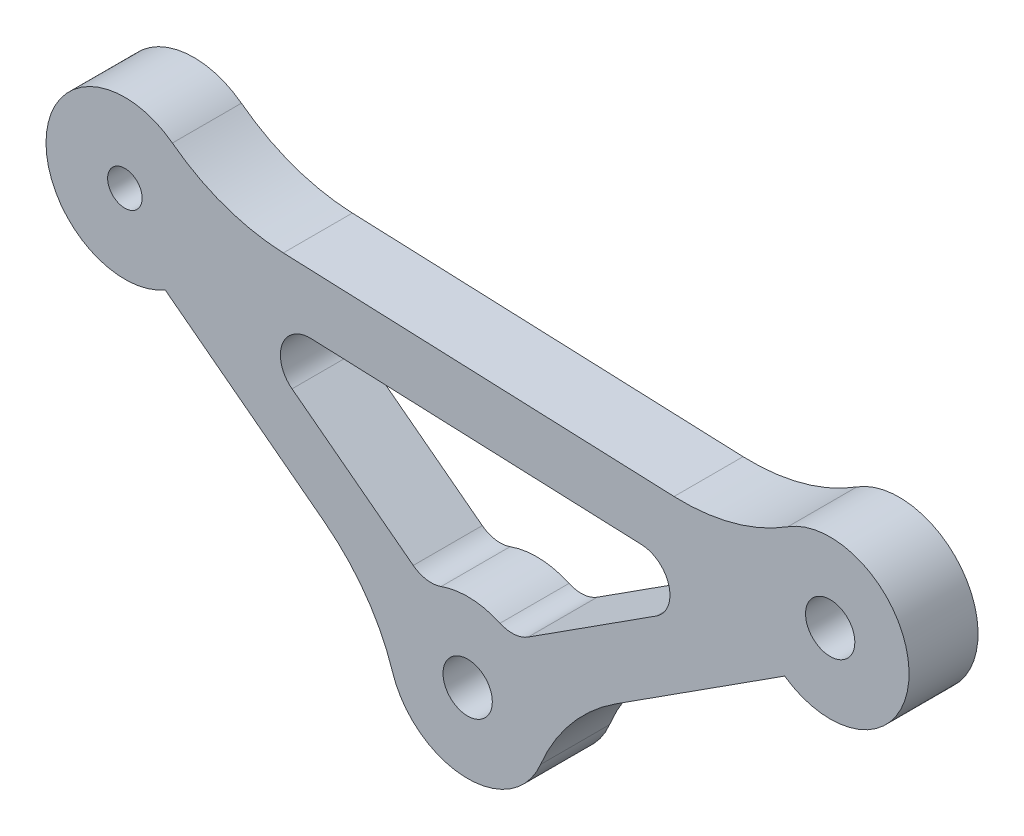
ISO-10303-21;
HEADER;
FILE_DESCRIPTION(('STEP AP214'),'2;1');
FILE_NAME('part.step','',(''),(''),'','','');
FILE_SCHEMA(('AUTOMOTIVE_DESIGN { 1 0 10303 214 1 1 1 1 }'));
ENDSEC;
DATA;
#1=APPLICATION_CONTEXT('core data for automotive mechanical design processes');
#2=APPLICATION_PROTOCOL_DEFINITION('international standard','automotive_design',2000,#1);
#3=PRODUCT_CONTEXT('',#1,'mechanical');
#4=PRODUCT('Part','Part','',(#3));
#5=PRODUCT_RELATED_PRODUCT_CATEGORY('part','',(#4));
#6=PRODUCT_DEFINITION_FORMATION('','',#4);
#7=PRODUCT_DEFINITION_CONTEXT('part definition',#1,'design');
#8=PRODUCT_DEFINITION('design','',#6,#7);
#9=PRODUCT_DEFINITION_SHAPE('','',#8);
#10=(LENGTH_UNIT() NAMED_UNIT(*) SI_UNIT(.MILLI.,.METRE.));
#11=(NAMED_UNIT(*) PLANE_ANGLE_UNIT() SI_UNIT($,.RADIAN.));
#12=(NAMED_UNIT(*) SI_UNIT($,.STERADIAN.) SOLID_ANGLE_UNIT());
#13=UNCERTAINTY_MEASURE_WITH_UNIT(LENGTH_MEASURE(1.E-05),#10,'distance_accuracy_value','');
#14=(GEOMETRIC_REPRESENTATION_CONTEXT(3) GLOBAL_UNCERTAINTY_ASSIGNED_CONTEXT((#13)) GLOBAL_UNIT_ASSIGNED_CONTEXT((#10,
#11,#12)) REPRESENTATION_CONTEXT('',''));
#15=CARTESIAN_POINT('',(0.,0.,0.));
#16=DIRECTION('',(0.,0.,1.));
#17=DIRECTION('',(1.,0.,0.));
#18=AXIS2_PLACEMENT_3D('',#15,#16,#17);
#19=CARTESIAN_POINT('',(-75.8246183935095,230.884392151583,7.));
#20=DIRECTION('',(0.,0.,-1.));
#21=DIRECTION('',(-1.,0.,0.));
#22=AXIS2_PLACEMENT_3D('',#19,#20,#21);
#23=CYLINDRICAL_SURFACE('',#22,8.00000000000001);
#24=CARTESIAN_POINT('',(-75.8246183935095,230.884392151583,7.));
#25=DIRECTION('',(0.,0.,1.));
#26=DIRECTION('',(1.,0.,0.));
#27=AXIS2_PLACEMENT_3D('',#24,#25,#26);
#28=CIRCLE('',#27,8.00000000000001);
#29=CARTESIAN_POINT('',(-71.0034898818186,237.268491138422,7.));
#30=VERTEX_POINT('',#29);
#31=CARTESIAN_POINT('',(-71.7416742694759,224.004743375663,7.));
#32=VERTEX_POINT('',#31);
#33=EDGE_CURVE('E229',#30,#32,#28,.T.);
#34=ORIENTED_EDGE('',*,*,#33,.F.);
#35=DIRECTION('',(0.,0.,-1.));
#36=VECTOR('',#35,1.);
#37=CARTESIAN_POINT('',(-71.0034898818186,237.268491138422,7.));
#38=LINE('',#37,#36);
#39=CARTESIAN_POINT('',(-71.0034898818186,237.268491138422,0.));
#40=VERTEX_POINT('',#39);
#41=EDGE_CURVE('E278',#30,#40,#38,.T.);
#42=ORIENTED_EDGE('',*,*,#41,.T.);
#43=CARTESIAN_POINT('',(-75.8246183935095,230.884392151583,0.));
#44=DIRECTION('',(0.,0.,1.));
#45=DIRECTION('',(1.,0.,0.));
#46=AXIS2_PLACEMENT_3D('',#43,#44,#45);
#47=CIRCLE('',#46,8.00000000000001);
#48=CARTESIAN_POINT('',(-71.7416742694759,224.004743375663,0.));
#49=VERTEX_POINT('',#48);
#50=EDGE_CURVE('E230',#40,#49,#47,.T.);
#51=ORIENTED_EDGE('',*,*,#50,.T.);
#52=DIRECTION('',(0.,0.,-1.));
#53=VECTOR('',#52,1.);
#54=CARTESIAN_POINT('',(-71.7416742694759,224.004743375663,7.));
#55=LINE('',#54,#53);
#56=EDGE_CURVE('E179',#32,#49,#55,.T.);
#57=ORIENTED_EDGE('',*,*,#56,.F.);
#58=EDGE_LOOP('',(#34,#42,#51,#57));
#59=FACE_BOUND('',#58,.T.);
#60=ADVANCED_FACE('F34',(#59),#23,.T.);
#61=CARTESIAN_POINT('',(-75.8246183935095,230.884392151583,7.));
#62=DIRECTION('',(0.,0.,-1.));
#63=DIRECTION('',(-1.,0.,0.));
#64=AXIS2_PLACEMENT_3D('',#61,#62,#63);
#65=CYLINDRICAL_SURFACE('',#64,1.75);
#66=CARTESIAN_POINT('',(-75.8246183935095,230.884392151583,7.));
#67=DIRECTION('',(0.,0.,1.));
#68=DIRECTION('',(1.,0.,0.));
#69=AXIS2_PLACEMENT_3D('',#66,#67,#68);
#70=CIRCLE('',#69,1.75);
#71=CARTESIAN_POINT('',(-74.0746183935095,230.884392151583,7.));
#72=VERTEX_POINT('',#71);
#73=EDGE_CURVE('E226',#72,#72,#70,.T.);
#74=ORIENTED_EDGE('',*,*,#73,.T.);
#75=EDGE_LOOP('',(#74));
#76=FACE_BOUND('',#75,.T.);
#77=CARTESIAN_POINT('',(-75.8246183935095,230.884392151583,0.));
#78=DIRECTION('',(0.,0.,1.));
#79=DIRECTION('',(1.,0.,0.));
#80=AXIS2_PLACEMENT_3D('',#77,#78,#79);
#81=CIRCLE('',#80,1.75);
#82=CARTESIAN_POINT('',(-74.0746183935095,230.884392151583,0.));
#83=VERTEX_POINT('',#82);
#84=EDGE_CURVE('E225',#83,#83,#81,.T.);
#85=ORIENTED_EDGE('',*,*,#84,.F.);
#86=EDGE_LOOP('',(#85));
#87=FACE_BOUND('',#86,.T.);
#88=ADVANCED_FACE('F344',(#76,#87),#65,.F.);
#89=CARTESIAN_POINT('',(0.,0.,7.));
#90=DIRECTION('',(0.,0.,1.));
#91=DIRECTION('',(1.,0.,0.));
#92=AXIS2_PLACEMENT_3D('',#89,#90,#91);
#93=PLANE('',#92);
#94=DIRECTION('',(0.795607349426792,-0.605812632369179,0.));
#95=VECTOR('',#94,1.);
#96=CARTESIAN_POINT('',(81.6379821522602,107.214302116319,7.));
#97=LINE('',#96,#95);
#98=CARTESIAN_POINT('',(-55.5738789971967,211.693828172878,7.));
#99=VERTEX_POINT('',#98);
#100=EDGE_CURVE('E198',#32,#99,#97,.T.);
#101=ORIENTED_EDGE('',*,*,#100,.T.);
#102=CARTESIAN_POINT('',(-67.6901316445803,195.781681184342,7.));
#103=DIRECTION('',(0.,0.,1.));
#104=DIRECTION('',(1.,0.,0.));
#105=AXIS2_PLACEMENT_3D('',#102,#103,#104);
#106=CIRCLE('',#105,20.);
#107=CARTESIAN_POINT('',(-48.6626165887926,201.942336247059,7.));
#108=VERTEX_POINT('',#107);
#109=EDGE_CURVE('E11',#99,#108,#106,.F.);
#110=ORIENTED_EDGE('',*,*,#109,.T.);
#111=CARTESIAN_POINT('',(-41.0516105664775,204.406598272145,7.));
#112=DIRECTION('',(0.,0.,1.));
#113=DIRECTION('',(1.,0.,0.));
#114=AXIS2_PLACEMENT_3D('',#111,#112,#113);
#115=CIRCLE('',#114,8.);
#116=CARTESIAN_POINT('',(-33.6613972737846,201.343144748995,7.));
#117=VERTEX_POINT('',#116);
#118=EDGE_CURVE('E304',#108,#117,#115,.T.);
#119=ORIENTED_EDGE('',*,*,#118,.T.);
#120=CARTESIAN_POINT('',(-15.1858640420522,193.684510941118,7.));
#121=DIRECTION('',(0.,0.,1.));
#122=DIRECTION('',(1.,0.,0.));
#123=AXIS2_PLACEMENT_3D('',#120,#121,#122);
#124=CIRCLE('',#123,20.);
#125=CARTESIAN_POINT('',(-25.9943886810119,210.51233893908,7.));
#126=VERTEX_POINT('',#125);
#127=EDGE_CURVE('E297',#117,#126,#124,.F.);
#128=ORIENTED_EDGE('',*,*,#127,.T.);
#129=DIRECTION('',(0.84139139989811,0.540426231947987,0.));
#130=VECTOR('',#129,1.);
#131=CARTESIAN_POINT('',(-103.313996709106,160.849905465932,7.));
#132=LINE('',#131,#130);
#133=CARTESIAN_POINT('',(-8.89620085354924,221.494515868691,7.));
#134=VERTEX_POINT('',#133);
#135=EDGE_CURVE('E180',#126,#134,#132,.T.);
#136=ORIENTED_EDGE('',*,*,#135,.T.);
#137=CARTESIAN_POINT('',(-4.27755392241352,228.026598272145,7.));
#138=DIRECTION('',(0.,0.,1.));
#139=DIRECTION('',(1.,0.,0.));
#140=AXIS2_PLACEMENT_3D('',#137,#138,#139);
#141=CIRCLE('',#140,8.);
#142=CARTESIAN_POINT('',(-8.57413749411873,234.774884692515,7.));
#143=VERTEX_POINT('',#142);
#144=EDGE_CURVE('E178',#134,#143,#141,.T.);
#145=ORIENTED_EDGE('',*,*,#144,.T.);
#146=CARTESIAN_POINT('',(-19.3155964233818,251.645600743441,7.));
#147=DIRECTION('',(0.,0.,1.));
#148=DIRECTION('',(1.,0.,0.));
#149=AXIS2_PLACEMENT_3D('',#146,#147,#148);
#150=CIRCLE('',#149,20.);
#151=CARTESIAN_POINT('',(-20.1138169842295,231.66153599334,7.));
#152=VERTEX_POINT('',#151);
#153=EDGE_CURVE('E282',#143,#152,#150,.F.);
#154=ORIENTED_EDGE('',*,*,#153,.T.);
#155=DIRECTION('',(-0.999203237505063,0.0399110280423881,0.));
#156=VECTOR('',#155,1.);
#157=CARTESIAN_POINT('',(9.20644421166959,230.490401110189,7.));
#158=LINE('',#157,#156);
#159=CARTESIAN_POINT('',(-59.7488891634392,233.244673855419,7.));
#160=VERTEX_POINT('',#159);
#161=EDGE_CURVE('E169',#152,#160,#158,.T.);
#162=ORIENTED_EDGE('',*,*,#161,.T.);
#163=CARTESIAN_POINT('',(-58.9506686025914,253.22873860552,7.));
#164=DIRECTION('',(0.,0.,1.));
#165=DIRECTION('',(1.,0.,0.));
#166=AXIS2_PLACEMENT_3D('',#163,#164,#165);
#167=CIRCLE('',#166,20.);
#168=EDGE_CURVE('E286',#160,#30,#167,.F.);
#169=ORIENTED_EDGE('',*,*,#168,.T.);
#170=ORIENTED_EDGE('',*,*,#33,.T.);
#171=EDGE_LOOP('',(#101,#110,#119,#128,#136,#145,#154,#162,#169,#170));
#172=FACE_BOUND('',#171,.T.);
#173=ORIENTED_EDGE('',*,*,#73,.F.);
#174=EDGE_LOOP('',(#173));
#175=FACE_BOUND('',#174,.T.);
#176=DIRECTION('',(0.84139139989811,0.540426231947986,0.));
#177=VECTOR('',#176,1.);
#178=CARTESIAN_POINT('',(-106.556554100794,165.898253865321,7.));
#179=LINE('',#178,#177);
#180=CARTESIAN_POINT('',(-34.9156438449769,211.913256143171,7.));
#181=VERTEX_POINT('',#180);
#182=CARTESIAN_POINT('',(-21.9101481622772,220.266694301998,7.));
#183=VERTEX_POINT('',#182);
#184=EDGE_CURVE('E206',#181,#183,#179,.T.);
#185=ORIENTED_EDGE('',*,*,#184,.F.);
#186=CARTESIAN_POINT('',(-36.5369225408209,214.437430342866,7.));
#187=DIRECTION('',(0.,0.,1.));
#188=DIRECTION('',(1.,0.,0.));
#189=AXIS2_PLACEMENT_3D('',#186,#187,#188);
#190=CIRCLE('',#189,3.);
#191=CARTESIAN_POINT('',(-37.7682010932727,211.701748869033,7.));
#192=VERTEX_POINT('',#191);
#193=EDGE_CURVE('E261',#181,#192,#190,.F.);
#194=ORIENTED_EDGE('',*,*,#193,.T.);
#195=CARTESIAN_POINT('',(-43.7427098642042,211.940387794675,7.));
#196=VERTEX_POINT('',#195);
#197=EDGE_CURVE('E192',#192,#196,#115,.T.);
#198=ORIENTED_EDGE('',*,*,#197,.T.);
#199=CARTESIAN_POINT('',(-44.7518721008517,214.765558865623,7.));
#200=DIRECTION('',(0.,0.,1.));
#201=DIRECTION('',(1.,0.,0.));
#202=AXIS2_PLACEMENT_3D('',#199,#200,#201);
#203=CIRCLE('',#202,3.);
#204=CARTESIAN_POINT('',(-46.5693099979593,212.378736817343,7.));
#205=VERTEX_POINT('',#204);
#206=EDGE_CURVE('E257',#196,#205,#203,.F.);
#207=ORIENTED_EDGE('',*,*,#206,.T.);
#208=DIRECTION('',(0.795607349426791,-0.605812632369181,0.));
#209=VECTOR('',#208,1.);
#210=CARTESIAN_POINT('',(85.2728579464753,111.987946212879,7.));
#211=LINE('',#210,#209);
#212=CARTESIAN_POINT('',(-58.8671156914182,221.742861023695,7.));
#213=VERTEX_POINT('',#212);
#214=EDGE_CURVE('E200',#213,#205,#211,.T.);
#215=ORIENTED_EDGE('',*,*,#214,.F.);
#216=CARTESIAN_POINT('',(-57.0496777943106,224.129683071975,7.));
#217=DIRECTION('',(0.,0.,1.));
#218=DIRECTION('',(1.,0.,0.));
#219=AXIS2_PLACEMENT_3D('',#216,#217,#218);
#220=CIRCLE('',#219,3.);
#221=CARTESIAN_POINT('',(-56.9299447101834,227.127292784491,7.));
#222=VERTEX_POINT('',#221);
#223=EDGE_CURVE('E269',#213,#222,#220,.F.);
#224=ORIENTED_EDGE('',*,*,#223,.T.);
#225=DIRECTION('',(-0.999203237505063,0.0399110280423876,0.));
#226=VECTOR('',#225,1.);
#227=CARTESIAN_POINT('',(8.96697804341517,224.495181685158,7.));
#228=LINE('',#227,#226);
#229=CARTESIAN_POINT('',(-23.411693773994,225.788478214207,7.));
#230=VERTEX_POINT('',#229);
#231=EDGE_CURVE('E203',#230,#222,#228,.T.);
#232=ORIENTED_EDGE('',*,*,#231,.F.);
#233=CARTESIAN_POINT('',(-23.5314268581212,222.790868501692,7.));
#234=DIRECTION('',(0.,0.,1.));
#235=DIRECTION('',(1.,0.,0.));
#236=AXIS2_PLACEMENT_3D('',#233,#234,#235);
#237=CIRCLE('',#236,3.);
#238=EDGE_CURVE('E265',#230,#183,#237,.F.);
#239=ORIENTED_EDGE('',*,*,#238,.T.);
#240=EDGE_LOOP('',(#185,#194,#198,#207,#215,#224,#232,#239));
#241=FACE_BOUND('',#240,.T.);
#242=CARTESIAN_POINT('',(-4.27755392241352,228.026598272145,7.));
#243=DIRECTION('',(0.,0.,1.));
#244=DIRECTION('',(1.,0.,0.));
#245=AXIS2_PLACEMENT_3D('',#242,#243,#244);
#246=CIRCLE('',#245,2.5);
#247=CARTESIAN_POINT('',(-1.77755392241352,228.026598272145,7.));
#248=VERTEX_POINT('',#247);
#249=EDGE_CURVE('E186',#248,#248,#246,.T.);
#250=ORIENTED_EDGE('',*,*,#249,.F.);
#251=EDGE_LOOP('',(#250));
#252=FACE_BOUND('',#251,.T.);
#253=CARTESIAN_POINT('',(-41.0516105664775,204.406598272145,7.));
#254=DIRECTION('',(0.,0.,1.));
#255=DIRECTION('',(1.,0.,0.));
#256=AXIS2_PLACEMENT_3D('',#253,#254,#255);
#257=CIRCLE('',#256,2.5);
#258=CARTESIAN_POINT('',(-38.5516105664775,204.406598272145,7.));
#259=VERTEX_POINT('',#258);
#260=EDGE_CURVE('E317',#259,#259,#257,.T.);
#261=ORIENTED_EDGE('',*,*,#260,.F.);
#262=EDGE_LOOP('',(#261));
#263=FACE_BOUND('',#262,.T.);
#264=ADVANCED_FACE('F301',(#172,#175,#241,#252,#263),#93,.T.);
#265=CARTESIAN_POINT('',(0.,0.,0.));
#266=DIRECTION('',(0.,0.,1.));
#267=DIRECTION('',(1.,0.,0.));
#268=AXIS2_PLACEMENT_3D('',#265,#266,#267);
#269=PLANE('',#268);
#270=CARTESIAN_POINT('',(-41.0516105664775,204.406598272145,0.));
#271=DIRECTION('',(0.,0.,1.));
#272=DIRECTION('',(1.,0.,0.));
#273=AXIS2_PLACEMENT_3D('',#270,#271,#272);
#274=CIRCLE('',#273,8.);
#275=CARTESIAN_POINT('',(-48.6626165887926,201.942336247059,0.));
#276=VERTEX_POINT('',#275);
#277=CARTESIAN_POINT('',(-33.6613972737846,201.343144748995,0.));
#278=VERTEX_POINT('',#277);
#279=EDGE_CURVE('E309',#276,#278,#274,.T.);
#280=ORIENTED_EDGE('',*,*,#279,.F.);
#281=CARTESIAN_POINT('',(-67.6901316445803,195.781681184342,0.));
#282=DIRECTION('',(0.,0.,1.));
#283=DIRECTION('',(1.,0.,0.));
#284=AXIS2_PLACEMENT_3D('',#281,#282,#283);
#285=CIRCLE('',#284,20.);
#286=CARTESIAN_POINT('',(-55.5738789971967,211.693828172878,0.));
#287=VERTEX_POINT('',#286);
#288=EDGE_CURVE('E42',#276,#287,#285,.T.);
#289=ORIENTED_EDGE('',*,*,#288,.T.);
#290=DIRECTION('',(0.795607349426792,-0.605812632369179,0.));
#291=VECTOR('',#290,1.);
#292=CARTESIAN_POINT('',(81.6379821522602,107.214302116319,0.));
#293=LINE('',#292,#291);
#294=EDGE_CURVE('E213',#49,#287,#293,.T.);
#295=ORIENTED_EDGE('',*,*,#294,.F.);
#296=ORIENTED_EDGE('',*,*,#50,.F.);
#297=CARTESIAN_POINT('',(-58.9506686025914,253.22873860552,0.));
#298=DIRECTION('',(0.,0.,1.));
#299=DIRECTION('',(1.,0.,0.));
#300=AXIS2_PLACEMENT_3D('',#297,#298,#299);
#301=CIRCLE('',#300,20.);
#302=CARTESIAN_POINT('',(-59.7488891634392,233.244673855419,0.));
#303=VERTEX_POINT('',#302);
#304=EDGE_CURVE('E284',#40,#303,#301,.T.);
#305=ORIENTED_EDGE('',*,*,#304,.T.);
#306=DIRECTION('',(-0.999203237505063,0.0399110280423881,0.));
#307=VECTOR('',#306,1.);
#308=CARTESIAN_POINT('',(9.20644421166959,230.490401110189,0.));
#309=LINE('',#308,#307);
#310=CARTESIAN_POINT('',(-20.1138169842295,231.66153599334,0.));
#311=VERTEX_POINT('',#310);
#312=EDGE_CURVE('E210',#311,#303,#309,.T.);
#313=ORIENTED_EDGE('',*,*,#312,.F.);
#314=CARTESIAN_POINT('',(-19.3155964233818,251.645600743441,0.));
#315=DIRECTION('',(0.,0.,1.));
#316=DIRECTION('',(1.,0.,0.));
#317=AXIS2_PLACEMENT_3D('',#314,#315,#316);
#318=CIRCLE('',#317,20.);
#319=CARTESIAN_POINT('',(-8.57413749411873,234.774884692515,0.));
#320=VERTEX_POINT('',#319);
#321=EDGE_CURVE('E185',#311,#320,#318,.T.);
#322=ORIENTED_EDGE('',*,*,#321,.T.);
#323=CARTESIAN_POINT('',(-4.27755392241352,228.026598272145,0.));
#324=DIRECTION('',(0.,0.,1.));
#325=DIRECTION('',(1.,0.,0.));
#326=AXIS2_PLACEMENT_3D('',#323,#324,#325);
#327=CIRCLE('',#326,8.);
#328=CARTESIAN_POINT('',(-8.89620085354927,221.494515868691,0.));
#329=VERTEX_POINT('',#328);
#330=EDGE_CURVE('E175',#329,#320,#327,.T.);
#331=ORIENTED_EDGE('',*,*,#330,.F.);
#332=DIRECTION('',(0.84139139989811,0.540426231947987,0.));
#333=VECTOR('',#332,1.);
#334=CARTESIAN_POINT('',(-103.313996709106,160.849905465932,0.));
#335=LINE('',#334,#333);
#336=CARTESIAN_POINT('',(-25.9943886810119,210.51233893908,0.));
#337=VERTEX_POINT('',#336);
#338=EDGE_CURVE('E160',#337,#329,#335,.T.);
#339=ORIENTED_EDGE('',*,*,#338,.F.);
#340=CARTESIAN_POINT('',(-15.1858640420522,193.684510941118,0.));
#341=DIRECTION('',(0.,0.,1.));
#342=DIRECTION('',(1.,0.,0.));
#343=AXIS2_PLACEMENT_3D('',#340,#341,#342);
#344=CIRCLE('',#343,20.);
#345=EDGE_CURVE('E295',#337,#278,#344,.T.);
#346=ORIENTED_EDGE('',*,*,#345,.T.);
#347=EDGE_LOOP('',(#280,#289,#295,#296,#305,#313,#322,#331,#339,#346));
#348=FACE_BOUND('',#347,.T.);
#349=ORIENTED_EDGE('',*,*,#84,.T.);
#350=EDGE_LOOP('',(#349));
#351=FACE_BOUND('',#350,.T.);
#352=DIRECTION('',(-0.999203237505063,0.0399110280423876,0.));
#353=VECTOR('',#352,1.);
#354=CARTESIAN_POINT('',(8.96697804341517,224.495181685158,0.));
#355=LINE('',#354,#353);
#356=CARTESIAN_POINT('',(-23.411693773994,225.788478214207,0.));
#357=VERTEX_POINT('',#356);
#358=CARTESIAN_POINT('',(-56.9299447101834,227.127292784491,0.));
#359=VERTEX_POINT('',#358);
#360=EDGE_CURVE('E218',#357,#359,#355,.T.);
#361=ORIENTED_EDGE('',*,*,#360,.T.);
#362=CARTESIAN_POINT('',(-57.0496777943106,224.129683071975,0.));
#363=DIRECTION('',(0.,0.,1.));
#364=DIRECTION('',(1.,0.,0.));
#365=AXIS2_PLACEMENT_3D('',#362,#363,#364);
#366=CIRCLE('',#365,3.);
#367=CARTESIAN_POINT('',(-58.8671156914182,221.742861023695,0.));
#368=VERTEX_POINT('',#367);
#369=EDGE_CURVE('E267',#359,#368,#366,.T.);
#370=ORIENTED_EDGE('',*,*,#369,.T.);
#371=DIRECTION('',(0.795607349426791,-0.605812632369181,0.));
#372=VECTOR('',#371,1.);
#373=CARTESIAN_POINT('',(85.2728579464753,111.987946212879,0.));
#374=LINE('',#373,#372);
#375=CARTESIAN_POINT('',(-46.5693099979593,212.378736817343,0.));
#376=VERTEX_POINT('',#375);
#377=EDGE_CURVE('E215',#368,#376,#374,.T.);
#378=ORIENTED_EDGE('',*,*,#377,.T.);
#379=CARTESIAN_POINT('',(-44.7518721008517,214.765558865623,0.));
#380=DIRECTION('',(0.,0.,1.));
#381=DIRECTION('',(1.,0.,0.));
#382=AXIS2_PLACEMENT_3D('',#379,#380,#381);
#383=CIRCLE('',#382,3.);
#384=CARTESIAN_POINT('',(-43.7427098642042,211.940387794675,0.));
#385=VERTEX_POINT('',#384);
#386=EDGE_CURVE('E255',#376,#385,#383,.T.);
#387=ORIENTED_EDGE('',*,*,#386,.T.);
#388=CARTESIAN_POINT('',(-37.7682010932727,211.701748869033,0.));
#389=VERTEX_POINT('',#388);
#390=EDGE_CURVE('E313',#389,#385,#274,.T.);
#391=ORIENTED_EDGE('',*,*,#390,.F.);
#392=CARTESIAN_POINT('',(-36.5369225408209,214.437430342866,0.));
#393=DIRECTION('',(0.,0.,1.));
#394=DIRECTION('',(1.,0.,0.));
#395=AXIS2_PLACEMENT_3D('',#392,#393,#394);
#396=CIRCLE('',#395,3.);
#397=CARTESIAN_POINT('',(-34.9156438449769,211.913256143171,0.));
#398=VERTEX_POINT('',#397);
#399=EDGE_CURVE('E259',#389,#398,#396,.T.);
#400=ORIENTED_EDGE('',*,*,#399,.T.);
#401=DIRECTION('',(0.84139139989811,0.540426231947986,0.));
#402=VECTOR('',#401,1.);
#403=CARTESIAN_POINT('',(-106.556554100794,165.898253865321,0.));
#404=LINE('',#403,#402);
#405=CARTESIAN_POINT('',(-21.9101481622772,220.266694301998,0.));
#406=VERTEX_POINT('',#405);
#407=EDGE_CURVE('E170',#398,#406,#404,.T.);
#408=ORIENTED_EDGE('',*,*,#407,.T.);
#409=CARTESIAN_POINT('',(-23.5314268581212,222.790868501692,0.));
#410=DIRECTION('',(0.,0.,1.));
#411=DIRECTION('',(1.,0.,0.));
#412=AXIS2_PLACEMENT_3D('',#409,#410,#411);
#413=CIRCLE('',#412,3.);
#414=EDGE_CURVE('E263',#406,#357,#413,.T.);
#415=ORIENTED_EDGE('',*,*,#414,.T.);
#416=EDGE_LOOP('',(#361,#370,#378,#387,#391,#400,#408,#415));
#417=FACE_BOUND('',#416,.T.);
#418=CARTESIAN_POINT('',(-4.27755392241352,228.026598272145,0.));
#419=DIRECTION('',(0.,0.,1.));
#420=DIRECTION('',(1.,0.,0.));
#421=AXIS2_PLACEMENT_3D('',#418,#419,#420);
#422=CIRCLE('',#421,2.5);
#423=CARTESIAN_POINT('',(-1.77755392241352,228.026598272145,0.));
#424=VERTEX_POINT('',#423);
#425=EDGE_CURVE('E187',#424,#424,#422,.T.);
#426=ORIENTED_EDGE('',*,*,#425,.T.);
#427=EDGE_LOOP('',(#426));
#428=FACE_BOUND('',#427,.T.);
#429=CARTESIAN_POINT('',(-41.0516105664775,204.406598272145,0.));
#430=DIRECTION('',(0.,0.,1.));
#431=DIRECTION('',(1.,0.,0.));
#432=AXIS2_PLACEMENT_3D('',#429,#430,#431);
#433=CIRCLE('',#432,2.5);
#434=CARTESIAN_POINT('',(-38.5516105664775,204.406598272145,0.));
#435=VERTEX_POINT('',#434);
#436=EDGE_CURVE('E314',#435,#435,#433,.T.);
#437=ORIENTED_EDGE('',*,*,#436,.T.);
#438=EDGE_LOOP('',(#437));
#439=FACE_BOUND('',#438,.T.);
#440=ADVANCED_FACE('F182',(#348,#351,#417,#428,#439),#269,.F.);
#441=CARTESIAN_POINT('',(9.20644421166959,230.490401110189,7.));
#442=DIRECTION('',(-0.0399110280423881,-0.999203237505063,0.));
#443=DIRECTION('',(0.999203237505063,-0.0399110280423881,0.));
#444=AXIS2_PLACEMENT_3D('',#441,#442,#443);
#445=PLANE('',#444);
#446=ORIENTED_EDGE('',*,*,#161,.F.);
#447=DIRECTION('',(0.,0.,1.));
#448=VECTOR('',#447,1.);
#449=CARTESIAN_POINT('',(-20.1138169842295,231.66153599334,0.));
#450=LINE('',#449,#448);
#451=EDGE_CURVE('E273',#152,#311,#450,.F.);
#452=ORIENTED_EDGE('',*,*,#451,.T.);
#453=ORIENTED_EDGE('',*,*,#312,.T.);
#454=DIRECTION('',(0.,0.,1.));
#455=VECTOR('',#454,1.);
#456=CARTESIAN_POINT('',(-59.7488891634392,233.244673855419,7.));
#457=LINE('',#456,#455);
#458=EDGE_CURVE('E271',#303,#160,#457,.T.);
#459=ORIENTED_EDGE('',*,*,#458,.T.);
#460=EDGE_LOOP('',(#446,#452,#453,#459));
#461=FACE_BOUND('',#460,.T.);
#462=ADVANCED_FACE('F327',(#461),#445,.F.);
#463=CARTESIAN_POINT('',(81.6379821522602,107.214302116319,7.));
#464=DIRECTION('',(0.605812632369179,0.795607349426792,0.));
#465=DIRECTION('',(-0.795607349426792,0.605812632369179,0.));
#466=AXIS2_PLACEMENT_3D('',#463,#464,#465);
#467=PLANE('',#466);
#468=ORIENTED_EDGE('',*,*,#294,.T.);
#469=DIRECTION('',(0.,0.,1.));
#470=VECTOR('',#469,1.);
#471=CARTESIAN_POINT('',(-55.5738789971967,211.693828172878,7.));
#472=LINE('',#471,#470);
#473=EDGE_CURVE('E49',#287,#99,#472,.T.);
#474=ORIENTED_EDGE('',*,*,#473,.T.);
#475=ORIENTED_EDGE('',*,*,#100,.F.);
#476=ORIENTED_EDGE('',*,*,#56,.T.);
#477=EDGE_LOOP('',(#468,#474,#475,#476));
#478=FACE_BOUND('',#477,.T.);
#479=ADVANCED_FACE('F419',(#478),#467,.F.);
#480=CARTESIAN_POINT('',(85.2728579464753,111.987946212879,7.));
#481=DIRECTION('',(0.605812632369181,0.795607349426791,0.));
#482=DIRECTION('',(-0.795607349426791,0.605812632369181,0.));
#483=AXIS2_PLACEMENT_3D('',#480,#481,#482);
#484=PLANE('',#483);
#485=ORIENTED_EDGE('',*,*,#214,.T.);
#486=DIRECTION('',(0.,0.,-1.));
#487=VECTOR('',#486,1.);
#488=CARTESIAN_POINT('',(-46.5693099979593,212.378736817343,7.));
#489=LINE('',#488,#487);
#490=EDGE_CURVE('E237',#205,#376,#489,.T.);
#491=ORIENTED_EDGE('',*,*,#490,.T.);
#492=ORIENTED_EDGE('',*,*,#377,.F.);
#493=DIRECTION('',(0.,0.,-1.));
#494=VECTOR('',#493,1.);
#495=CARTESIAN_POINT('',(-58.8671156914181,221.742861023695,7.));
#496=LINE('',#495,#494);
#497=EDGE_CURVE('E232',#368,#213,#496,.F.);
#498=ORIENTED_EDGE('',*,*,#497,.T.);
#499=EDGE_LOOP('',(#485,#491,#492,#498));
#500=FACE_BOUND('',#499,.T.);
#501=ADVANCED_FACE('F424',(#500),#484,.T.);
#502=CARTESIAN_POINT('',(8.96697804341517,224.495181685158,7.));
#503=DIRECTION('',(-0.0399110280423876,-0.999203237505063,0.));
#504=DIRECTION('',(0.999203237505063,-0.0399110280423876,0.));
#505=AXIS2_PLACEMENT_3D('',#502,#503,#504);
#506=PLANE('',#505);
#507=ORIENTED_EDGE('',*,*,#360,.F.);
#508=DIRECTION('',(0.,0.,-1.));
#509=VECTOR('',#508,1.);
#510=CARTESIAN_POINT('',(-23.411693773994,225.788478214207,7.));
#511=LINE('',#510,#509);
#512=EDGE_CURVE('E253',#357,#230,#511,.F.);
#513=ORIENTED_EDGE('',*,*,#512,.T.);
#514=ORIENTED_EDGE('',*,*,#231,.T.);
#515=DIRECTION('',(0.,0.,-1.));
#516=VECTOR('',#515,1.);
#517=CARTESIAN_POINT('',(-56.9299447101834,227.127292784491,0.));
#518=LINE('',#517,#516);
#519=EDGE_CURVE('E250',#222,#359,#518,.T.);
#520=ORIENTED_EDGE('',*,*,#519,.T.);
#521=EDGE_LOOP('',(#507,#513,#514,#520));
#522=FACE_BOUND('',#521,.T.);
#523=ADVANCED_FACE('F477',(#522),#506,.T.);
#524=CARTESIAN_POINT('',(-106.556554100794,165.898253865321,7.));
#525=DIRECTION('',(-0.540426231947986,0.84139139989811,0.));
#526=DIRECTION('',(-0.84139139989811,-0.540426231947986,0.));
#527=AXIS2_PLACEMENT_3D('',#524,#525,#526);
#528=PLANE('',#527);
#529=ORIENTED_EDGE('',*,*,#407,.F.);
#530=DIRECTION('',(0.,0.,-1.));
#531=VECTOR('',#530,1.);
#532=CARTESIAN_POINT('',(-34.9156438449769,211.913256143171,7.));
#533=LINE('',#532,#531);
#534=EDGE_CURVE('E248',#398,#181,#533,.F.);
#535=ORIENTED_EDGE('',*,*,#534,.T.);
#536=ORIENTED_EDGE('',*,*,#184,.T.);
#537=DIRECTION('',(0.,0.,-1.));
#538=VECTOR('',#537,1.);
#539=CARTESIAN_POINT('',(-21.9101481622772,220.266694301998,0.));
#540=LINE('',#539,#538);
#541=EDGE_CURVE('E245',#183,#406,#540,.T.);
#542=ORIENTED_EDGE('',*,*,#541,.T.);
#543=EDGE_LOOP('',(#529,#535,#536,#542));
#544=FACE_BOUND('',#543,.T.);
#545=ADVANCED_FACE('F410',(#544),#528,.T.);
#546=CARTESIAN_POINT('',(-103.313996709106,160.849905465932,7.));
#547=DIRECTION('',(-0.540426231947986,0.84139139989811,0.));
#548=DIRECTION('',(-0.84139139989811,-0.540426231947987,0.));
#549=AXIS2_PLACEMENT_3D('',#546,#547,#548);
#550=PLANE('',#549);
#551=ORIENTED_EDGE('',*,*,#135,.F.);
#552=DIRECTION('',(0.,0.,1.));
#553=VECTOR('',#552,1.);
#554=CARTESIAN_POINT('',(-25.994388681012,210.51233893908,0.));
#555=LINE('',#554,#553);
#556=EDGE_CURVE('E167',#126,#337,#555,.F.);
#557=ORIENTED_EDGE('',*,*,#556,.T.);
#558=ORIENTED_EDGE('',*,*,#338,.T.);
#559=DIRECTION('',(0.,0.,-1.));
#560=VECTOR('',#559,1.);
#561=CARTESIAN_POINT('',(-8.89620085354924,221.494515868691,7.));
#562=LINE('',#561,#560);
#563=EDGE_CURVE('E164',#134,#329,#562,.T.);
#564=ORIENTED_EDGE('',*,*,#563,.F.);
#565=EDGE_LOOP('',(#551,#557,#558,#564));
#566=FACE_BOUND('',#565,.T.);
#567=ADVANCED_FACE('F163',(#566),#550,.F.);
#568=CARTESIAN_POINT('',(-4.27755392241352,228.026598272145,7.));
#569=DIRECTION('',(0.,0.,-1.));
#570=DIRECTION('',(-1.,0.,0.));
#571=AXIS2_PLACEMENT_3D('',#568,#569,#570);
#572=CYLINDRICAL_SURFACE('',#571,8.);
#573=ORIENTED_EDGE('',*,*,#330,.T.);
#574=DIRECTION('',(0.,0.,-1.));
#575=VECTOR('',#574,1.);
#576=CARTESIAN_POINT('',(-8.57413749411874,234.774884692515,7.));
#577=LINE('',#576,#575);
#578=EDGE_CURVE('E276',#320,#143,#577,.F.);
#579=ORIENTED_EDGE('',*,*,#578,.T.);
#580=ORIENTED_EDGE('',*,*,#144,.F.);
#581=ORIENTED_EDGE('',*,*,#563,.T.);
#582=EDGE_LOOP('',(#573,#579,#580,#581));
#583=FACE_BOUND('',#582,.T.);
#584=ADVANCED_FACE('F174',(#583),#572,.T.);
#585=CARTESIAN_POINT('',(-4.27755392241352,228.026598272145,7.));
#586=DIRECTION('',(0.,0.,-1.));
#587=DIRECTION('',(-1.,0.,0.));
#588=AXIS2_PLACEMENT_3D('',#585,#586,#587);
#589=CYLINDRICAL_SURFACE('',#588,2.5);
#590=ORIENTED_EDGE('',*,*,#249,.T.);
#591=EDGE_LOOP('',(#590));
#592=FACE_BOUND('',#591,.T.);
#593=ORIENTED_EDGE('',*,*,#425,.F.);
#594=EDGE_LOOP('',(#593));
#595=FACE_BOUND('',#594,.T.);
#596=ADVANCED_FACE('F397',(#592,#595),#589,.F.);
#597=CARTESIAN_POINT('',(-41.0516105664775,204.406598272145,7.));
#598=DIRECTION('',(0.,0.,-1.));
#599=DIRECTION('',(-1.,0.,0.));
#600=AXIS2_PLACEMENT_3D('',#597,#598,#599);
#601=CYLINDRICAL_SURFACE('',#600,8.);
#602=ORIENTED_EDGE('',*,*,#279,.T.);
#603=DIRECTION('',(0.,0.,-1.));
#604=VECTOR('',#603,1.);
#605=CARTESIAN_POINT('',(-33.6613972737846,201.343144748995,7.));
#606=LINE('',#605,#604);
#607=EDGE_CURVE('E292',#278,#117,#606,.F.);
#608=ORIENTED_EDGE('',*,*,#607,.T.);
#609=ORIENTED_EDGE('',*,*,#118,.F.);
#610=DIRECTION('',(0.,0.,-1.));
#611=VECTOR('',#610,1.);
#612=CARTESIAN_POINT('',(-48.6626165887926,201.942336247059,7.));
#613=LINE('',#612,#611);
#614=EDGE_CURVE('E289',#108,#276,#613,.T.);
#615=ORIENTED_EDGE('',*,*,#614,.T.);
#616=EDGE_LOOP('',(#602,#608,#609,#615));
#617=FACE_BOUND('',#616,.T.);
#618=ADVANCED_FACE('F311',(#617),#601,.T.);
#619=CARTESIAN_POINT('',(-41.0516105664775,204.406598272145,7.));
#620=DIRECTION('',(0.,0.,-1.));
#621=DIRECTION('',(-1.,0.,0.));
#622=AXIS2_PLACEMENT_3D('',#619,#620,#621);
#623=CYLINDRICAL_SURFACE('',#622,2.5);
#624=ORIENTED_EDGE('',*,*,#260,.T.);
#625=EDGE_LOOP('',(#624));
#626=FACE_BOUND('',#625,.T.);
#627=ORIENTED_EDGE('',*,*,#436,.F.);
#628=EDGE_LOOP('',(#627));
#629=FACE_BOUND('',#628,.T.);
#630=ADVANCED_FACE('F396',(#626,#629),#623,.F.);
#631=ORIENTED_EDGE('',*,*,#390,.T.);
#632=DIRECTION('',(0.,0.,-1.));
#633=VECTOR('',#632,1.);
#634=CARTESIAN_POINT('',(-43.7427098642042,211.940387794675,7.));
#635=LINE('',#634,#633);
#636=EDGE_CURVE('E243',#385,#196,#635,.F.);
#637=ORIENTED_EDGE('',*,*,#636,.T.);
#638=ORIENTED_EDGE('',*,*,#197,.F.);
#639=DIRECTION('',(0.,0.,-1.));
#640=VECTOR('',#639,1.);
#641=CARTESIAN_POINT('',(-37.7682010932727,211.701748869033,7.));
#642=LINE('',#641,#640);
#643=EDGE_CURVE('E240',#192,#389,#642,.T.);
#644=ORIENTED_EDGE('',*,*,#643,.T.);
#645=EDGE_LOOP('',(#631,#637,#638,#644));
#646=FACE_BOUND('',#645,.T.);
#647=ADVANCED_FACE('F358',(#646),#601,.T.);
#648=CARTESIAN_POINT('',(-44.7518721008517,214.765558865623,7.));
#649=DIRECTION('',(0.,0.,-1.));
#650=DIRECTION('',(-1.,0.,0.));
#651=AXIS2_PLACEMENT_3D('',#648,#649,#650);
#652=CYLINDRICAL_SURFACE('',#651,3.);
#653=ORIENTED_EDGE('',*,*,#206,.F.);
#654=ORIENTED_EDGE('',*,*,#636,.F.);
#655=ORIENTED_EDGE('',*,*,#386,.F.);
#656=ORIENTED_EDGE('',*,*,#490,.F.);
#657=EDGE_LOOP('',(#653,#654,#655,#656));
#658=FACE_BOUND('',#657,.T.);
#659=ADVANCED_FACE('F354',(#658),#652,.F.);
#660=CARTESIAN_POINT('',(-36.5369225408209,214.437430342866,7.));
#661=DIRECTION('',(0.,0.,-1.));
#662=DIRECTION('',(-1.,0.,0.));
#663=AXIS2_PLACEMENT_3D('',#660,#661,#662);
#664=CYLINDRICAL_SURFACE('',#663,3.);
#665=ORIENTED_EDGE('',*,*,#193,.F.);
#666=ORIENTED_EDGE('',*,*,#534,.F.);
#667=ORIENTED_EDGE('',*,*,#399,.F.);
#668=ORIENTED_EDGE('',*,*,#643,.F.);
#669=EDGE_LOOP('',(#665,#666,#667,#668));
#670=FACE_BOUND('',#669,.T.);
#671=ADVANCED_FACE('F357',(#670),#664,.F.);
#672=CARTESIAN_POINT('',(-23.5314268581212,222.790868501692,7.));
#673=DIRECTION('',(0.,0.,1.));
#674=DIRECTION('',(1.,0.,0.));
#675=AXIS2_PLACEMENT_3D('',#672,#673,#674);
#676=CYLINDRICAL_SURFACE('',#675,3.);
#677=ORIENTED_EDGE('',*,*,#238,.F.);
#678=ORIENTED_EDGE('',*,*,#512,.F.);
#679=ORIENTED_EDGE('',*,*,#414,.F.);
#680=ORIENTED_EDGE('',*,*,#541,.F.);
#681=EDGE_LOOP('',(#677,#678,#679,#680));
#682=FACE_BOUND('',#681,.T.);
#683=ADVANCED_FACE('F362',(#682),#676,.F.);
#684=CARTESIAN_POINT('',(-57.0496777943106,224.129683071975,7.));
#685=DIRECTION('',(0.,0.,1.));
#686=DIRECTION('',(1.,0.,0.));
#687=AXIS2_PLACEMENT_3D('',#684,#685,#686);
#688=CYLINDRICAL_SURFACE('',#687,3.);
#689=ORIENTED_EDGE('',*,*,#223,.F.);
#690=ORIENTED_EDGE('',*,*,#497,.F.);
#691=ORIENTED_EDGE('',*,*,#369,.F.);
#692=ORIENTED_EDGE('',*,*,#519,.F.);
#693=EDGE_LOOP('',(#689,#690,#691,#692));
#694=FACE_BOUND('',#693,.T.);
#695=ADVANCED_FACE('F366',(#694),#688,.F.);
#696=CARTESIAN_POINT('',(-19.3155964233818,251.645600743441,7.));
#697=DIRECTION('',(0.,0.,-1.));
#698=DIRECTION('',(-1.,0.,0.));
#699=AXIS2_PLACEMENT_3D('',#696,#697,#698);
#700=CYLINDRICAL_SURFACE('',#699,20.);
#701=ORIENTED_EDGE('',*,*,#153,.F.);
#702=ORIENTED_EDGE('',*,*,#578,.F.);
#703=ORIENTED_EDGE('',*,*,#321,.F.);
#704=ORIENTED_EDGE('',*,*,#451,.F.);
#705=EDGE_LOOP('',(#701,#702,#703,#704));
#706=FACE_BOUND('',#705,.T.);
#707=ADVANCED_FACE('F325',(#706),#700,.F.);
#708=CARTESIAN_POINT('',(-58.9506686025914,253.22873860552,7.));
#709=DIRECTION('',(0.,0.,-1.));
#710=DIRECTION('',(-1.,0.,0.));
#711=AXIS2_PLACEMENT_3D('',#708,#709,#710);
#712=CYLINDRICAL_SURFACE('',#711,20.);
#713=ORIENTED_EDGE('',*,*,#168,.F.);
#714=ORIENTED_EDGE('',*,*,#458,.F.);
#715=ORIENTED_EDGE('',*,*,#304,.F.);
#716=ORIENTED_EDGE('',*,*,#41,.F.);
#717=EDGE_LOOP('',(#713,#714,#715,#716));
#718=FACE_BOUND('',#717,.T.);
#719=ADVANCED_FACE('F333',(#718),#712,.F.);
#720=CARTESIAN_POINT('',(-15.1858640420522,193.684510941118,7.));
#721=DIRECTION('',(0.,0.,-1.));
#722=DIRECTION('',(-1.,0.,0.));
#723=AXIS2_PLACEMENT_3D('',#720,#721,#722);
#724=CYLINDRICAL_SURFACE('',#723,20.);
#725=ORIENTED_EDGE('',*,*,#127,.F.);
#726=ORIENTED_EDGE('',*,*,#607,.F.);
#727=ORIENTED_EDGE('',*,*,#345,.F.);
#728=ORIENTED_EDGE('',*,*,#556,.F.);
#729=EDGE_LOOP('',(#725,#726,#727,#728));
#730=FACE_BOUND('',#729,.T.);
#731=ADVANCED_FACE('F307',(#730),#724,.F.);
#732=CARTESIAN_POINT('',(-67.6901316445803,195.781681184342,7.));
#733=DIRECTION('',(0.,0.,-1.));
#734=DIRECTION('',(-1.,0.,0.));
#735=AXIS2_PLACEMENT_3D('',#732,#733,#734);
#736=CYLINDRICAL_SURFACE('',#735,20.);
#737=ORIENTED_EDGE('',*,*,#109,.F.);
#738=ORIENTED_EDGE('',*,*,#473,.F.);
#739=ORIENTED_EDGE('',*,*,#288,.F.);
#740=ORIENTED_EDGE('',*,*,#614,.F.);
#741=EDGE_LOOP('',(#737,#738,#739,#740));
#742=FACE_BOUND('',#741,.T.);
#743=ADVANCED_FACE('F36',(#742),#736,.F.);
#744=CLOSED_SHELL('',(#60,#88,#264,#440,#462,#479,#501,#523,#545,#567,#584,#596,#618,#630,#647,
#659,#671,#683,#695,#707,#719,#731,#743));
#745=MANIFOLD_SOLID_BREP('B2',#744);
#746=ADVANCED_BREP_SHAPE_REPRESENTATION('',(#18,#745),#14);
#747=SHAPE_DEFINITION_REPRESENTATION(#9,#746);
ENDSEC;
END-ISO-10303-21;
